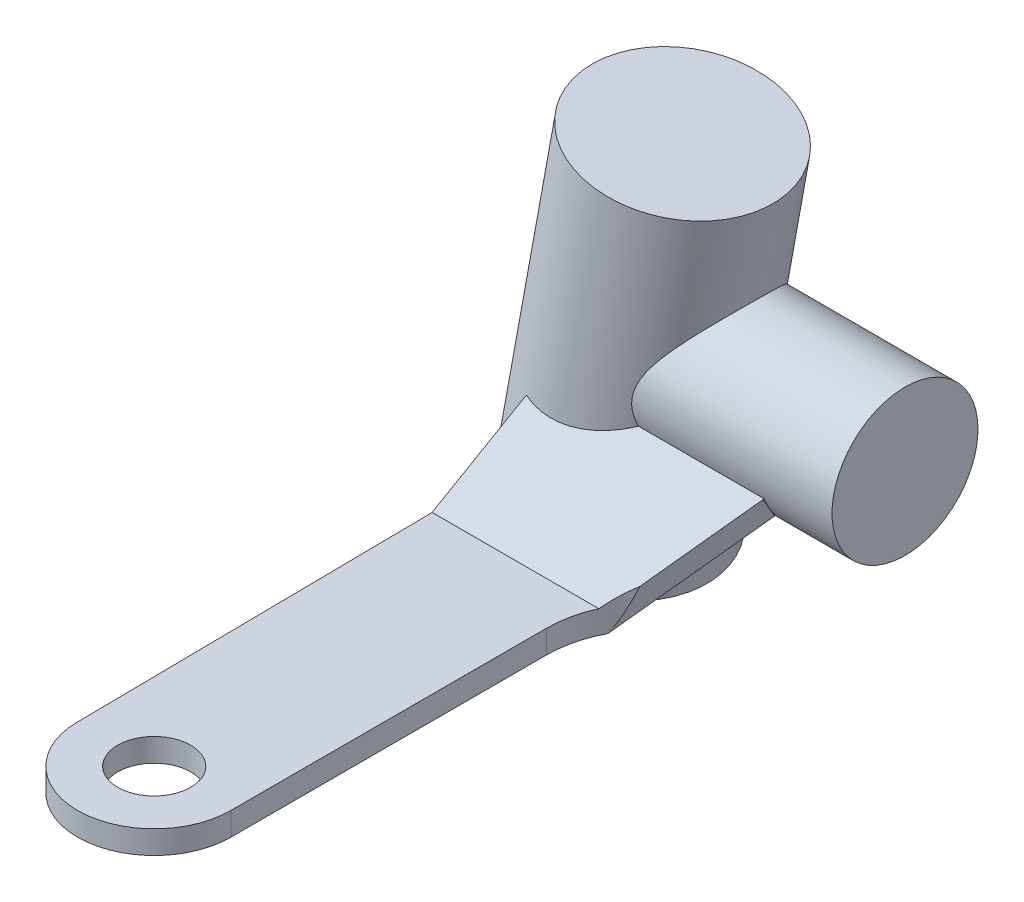
ISO-10303-21;
HEADER;
FILE_DESCRIPTION(('STEP AP214'),'2;1');
FILE_NAME('part.step','',(''),(''),'','','');
FILE_SCHEMA(('AUTOMOTIVE_DESIGN { 1 0 10303 214 1 1 1 1 }'));
ENDSEC;
DATA;
#1=APPLICATION_CONTEXT('core data for automotive mechanical design processes');
#2=APPLICATION_PROTOCOL_DEFINITION('international standard','automotive_design',2000,#1);
#3=PRODUCT_CONTEXT('',#1,'mechanical');
#4=PRODUCT('Part','Part','',(#3));
#5=PRODUCT_RELATED_PRODUCT_CATEGORY('part','',(#4));
#6=PRODUCT_DEFINITION_FORMATION('','',#4);
#7=PRODUCT_DEFINITION_CONTEXT('part definition',#1,'design');
#8=PRODUCT_DEFINITION('design','',#6,#7);
#9=PRODUCT_DEFINITION_SHAPE('','',#8);
#10=(LENGTH_UNIT() NAMED_UNIT(*) SI_UNIT(.MILLI.,.METRE.));
#11=(NAMED_UNIT(*) PLANE_ANGLE_UNIT() SI_UNIT($,.RADIAN.));
#12=(NAMED_UNIT(*) SI_UNIT($,.STERADIAN.) SOLID_ANGLE_UNIT());
#13=UNCERTAINTY_MEASURE_WITH_UNIT(LENGTH_MEASURE(1.E-05),#10,'distance_accuracy_value','');
#14=(GEOMETRIC_REPRESENTATION_CONTEXT(3) GLOBAL_UNCERTAINTY_ASSIGNED_CONTEXT((#13)) GLOBAL_UNIT_ASSIGNED_CONTEXT((#10,
#11,#12)) REPRESENTATION_CONTEXT('',''));
#15=CARTESIAN_POINT('',(0.,0.,0.));
#16=DIRECTION('',(0.,0.,1.));
#17=DIRECTION('',(1.,0.,0.));
#18=AXIS2_PLACEMENT_3D('',#15,#16,#17);
#19=CARTESIAN_POINT('',(-15.,1.37481532850781,0.793749999999992));
#20=DIRECTION('',(0.,0.866025403784441,0.499999999999995));
#21=DIRECTION('',(0.,-0.499999999999995,0.866025403784441));
#22=AXIS2_PLACEMENT_3D('',#19,#20,#21);
#23=PLANE('',#22);
#24=CARTESIAN_POINT('',(21.0561890606606,-15.8813614875702,30.6823249898396));
#25=DIRECTION('',(0.,0.866025403784441,0.499999999999995));
#26=DIRECTION('',(0.,-0.499999999999995,0.866025403784441));
#27=AXIS2_PLACEMENT_3D('',#24,#25,#26);
#28=ELLIPSE('',#27,16.7167610273511,14.4771397186797);
#29=CARTESIAN_POINT('',(10.0122158866274,-10.4770967837951,21.3218639453498));
#30=VERTEX_POINT('',#29);
#31=CARTESIAN_POINT('',(7.8311056060336,-12.4811290419705,24.7929496365167));
#32=VERTEX_POINT('',#31);
#33=EDGE_CURVE('E121',#30,#32,#28,.T.);
#34=ORIENTED_EDGE('',*,*,#33,.F.);
#35=DIRECTION('',(-0.342020143325663,-0.469846310392951,0.813797681349378));
#36=VECTOR('',#35,1.);
#37=CARTESIAN_POINT('',(14.7046046952174,-4.03098063634365,10.1568632664737));
#38=LINE('',#37,#36);
#39=CARTESIAN_POINT('',(15.,-3.62518467149215,9.45400403784441));
#40=VERTEX_POINT('',#39);
#41=EDGE_CURVE('E169',#40,#30,#38,.T.);
#42=ORIENTED_EDGE('',*,*,#41,.F.);
#43=DIRECTION('',(0.,-0.499999999999995,0.866025403784441));
#44=VECTOR('',#43,1.);
#45=CARTESIAN_POINT('',(15.,1.37481532850781,0.793749999999992));
#46=LINE('',#45,#44);
#47=CARTESIAN_POINT('',(15.,-3.56177873395059,9.3441817325209));
#48=VERTEX_POINT('',#47);
#49=EDGE_CURVE('E173',#48,#40,#46,.T.);
#50=ORIENTED_EDGE('',*,*,#49,.F.);
#51=DIRECTION('',(1.,0.,0.));
#52=VECTOR('',#51,1.);
#53=CARTESIAN_POINT('',(-10.,-3.56177873395059,9.3441817325209));
#54=LINE('',#53,#52);
#55=CARTESIAN_POINT('',(-2.17948771262395,-3.56177873395059,9.3441817325209));
#56=VERTEX_POINT('',#55);
#57=EDGE_CURVE('E407',#48,#56,#54,.F.);
#58=ORIENTED_EDGE('',*,*,#57,.T.);
#59=CARTESIAN_POINT('',(-9.67541691041208,1.8407542722661,-0.0132799238143488));
#60=DIRECTION('',(0.,0.866025403784441,0.499999999999995));
#61=DIRECTION('',(-0.328928894416636,-0.472177345501093,0.817835152590907));
#62=AXIS2_PLACEMENT_3D('',#59,#60,#61);
#63=ELLIPSE('',#62,14.7181064224041,12.5);
#64=CARTESIAN_POINT('',(-15.,-5.0179719781113,11.8663824170458));
#65=VERTEX_POINT('',#64);
#66=EDGE_CURVE('E187',#65,#56,#63,.T.);
#67=ORIENTED_EDGE('',*,*,#66,.F.);
#68=DIRECTION('',(0.,-0.499999999999995,0.866025403784441));
#69=VECTOR('',#68,1.);
#70=CARTESIAN_POINT('',(-15.,1.37481532850781,0.793749999999992));
#71=LINE('',#70,#69);
#72=CARTESIAN_POINT('',(-15.,-12.9064983849549,25.5297109505479));
#73=VERTEX_POINT('',#72);
#74=EDGE_CURVE('E179',#65,#73,#71,.T.);
#75=ORIENTED_EDGE('',*,*,#74,.T.);
#76=DIRECTION('',(1.,0.,0.));
#77=VECTOR('',#76,1.);
#78=CARTESIAN_POINT('',(-15.,-12.9064983849549,25.5297109505479));
#79=LINE('',#78,#77);
#80=CARTESIAN_POINT('',(-14.9816151833921,-12.9064983849549,25.5297109505479));
#81=VERTEX_POINT('',#80);
#82=EDGE_CURVE('E183',#73,#81,#79,.T.);
#83=ORIENTED_EDGE('',*,*,#82,.T.);
#84=DIRECTION('',(-0.0100289244147285,0.499974854536472,-0.865981850564039));
#85=VECTOR('',#84,1.);
#86=CARTESIAN_POINT('',(-15.2680550581169,1.37347110894734,0.79607825657525));
#87=LINE('',#86,#85);
#88=CARTESIAN_POINT('',(-14.9901476064738,-12.4811290419705,24.7929496365167));
#89=VERTEX_POINT('',#88);
#90=EDGE_CURVE('E51',#81,#89,#87,.T.);
#91=ORIENTED_EDGE('',*,*,#90,.T.);
#92=DIRECTION('',(1.,0.,0.));
#93=VECTOR('',#92,1.);
#94=CARTESIAN_POINT('',(-15.,-12.4811290419705,24.7929496365167));
#95=LINE('',#94,#93);
#96=EDGE_CURVE('E132',#89,#32,#95,.T.);
#97=ORIENTED_EDGE('',*,*,#96,.T.);
#98=EDGE_LOOP('',(#34,#42,#50,#58,#67,#75,#83,#91,#97));
#99=FACE_BOUND('',#98,.T.);
#100=ADVANCED_FACE('F34',(#99),#23,.T.);
#101=CARTESIAN_POINT('',(-15.,-12.9064983849549,25.5297109505479));
#102=DIRECTION('',(0.,-0.499999999999995,0.866025403784441));
#103=DIRECTION('',(0.,-0.866025403784441,-0.499999999999995));
#104=AXIS2_PLACEMENT_3D('',#101,#102,#103);
#105=PLANE('',#104);
#106=DIRECTION('',(0.,-0.866025403784441,-0.499999999999995));
#107=VECTOR('',#106,1.);
#108=CARTESIAN_POINT('',(-15.,-12.9064983849549,25.5297109505479));
#109=LINE('',#108,#107);
#110=CARTESIAN_POINT('',(-15.,-15.6561290419705,23.9422109505479));
#111=VERTEX_POINT('',#110);
#112=EDGE_CURVE('E181',#73,#111,#109,.T.);
#113=ORIENTED_EDGE('',*,*,#112,.T.);
#114=DIRECTION('',(0.0057903963451655,0.866010885314168,0.499991617757275));
#115=VECTOR('',#114,1.);
#116=CARTESIAN_POINT('',(-14.9816157998109,-12.9065905764684,25.5296577237528));
#117=LINE('',#116,#115);
#118=EDGE_CURVE('E59',#111,#81,#117,.T.);
#119=ORIENTED_EDGE('',*,*,#118,.T.);
#120=ORIENTED_EDGE('',*,*,#82,.F.);
#121=EDGE_LOOP('',(#113,#119,#120));
#122=FACE_BOUND('',#121,.T.);
#123=ADVANCED_FACE('F232',(#122),#105,.T.);
#124=CARTESIAN_POINT('',(15.,0.,0.));
#125=DIRECTION('',(1.,0.,0.));
#126=DIRECTION('',(0.,0.,-1.));
#127=AXIS2_PLACEMENT_3D('',#124,#125,#126);
#128=PLANE('',#127);
#129=DIRECTION('',(0.,0.866025403784441,0.499999999999995));
#130=VECTOR('',#129,1.);
#131=CARTESIAN_POINT('',(15.,-4.99999999999996,8.66025403784442));
#132=LINE('',#131,#130);
#133=CARTESIAN_POINT('',(15.,-6.37481532850775,7.86650403784443));
#134=VERTEX_POINT('',#133);
#135=CARTESIAN_POINT('',(15.,-4.99999999999996,8.66025403784442));
#136=VERTEX_POINT('',#135);
#137=EDGE_CURVE('E11',#134,#136,#132,.T.);
#138=ORIENTED_EDGE('',*,*,#137,.F.);
#139=DIRECTION('',(0.,0.499999999999995,-0.866025403784441));
#140=VECTOR('',#139,1.);
#141=CARTESIAN_POINT('',(15.,-15.6561290419705,23.9422109505479));
#142=LINE('',#141,#140);
#143=CARTESIAN_POINT('',(15.,-6.3114093909662,7.75668173252092));
#144=VERTEX_POINT('',#143);
#145=EDGE_CURVE('E171',#134,#144,#142,.T.);
#146=ORIENTED_EDGE('',*,*,#145,.T.);
#147=CARTESIAN_POINT('',(15.,0.,0.));
#148=DIRECTION('',(1.,0.,0.));
#149=DIRECTION('',(0.,0.,-1.));
#150=AXIS2_PLACEMENT_3D('',#147,#148,#149);
#151=CIRCLE('',#150,10.);
#152=EDGE_CURVE('E208',#144,#136,#151,.F.);
#153=ORIENTED_EDGE('',*,*,#152,.T.);
#154=EDGE_LOOP('',(#138,#146,#153));
#155=FACE_BOUND('',#154,.T.);
#156=ADVANCED_FACE('F215',(#155),#128,.T.);
#157=CARTESIAN_POINT('',(-5.65879555832661,24.6195531410487,-0.177615119509685));
#158=DIRECTION('',(-0.173648177666927,-0.984782125641946,0.00710460478038752));
#159=DIRECTION('',(0.984806980223185,-0.173652560314242,0.));
#160=AXIS2_PLACEMENT_3D('',#157,#158,#159);
#161=CYLINDRICAL_SURFACE('',#160,12.5);
#162=CARTESIAN_POINT('',(-2.37122751207205,0.,-10.));
#163=CARTESIAN_POINT('',(-2.33186606656457,0.211547890563131,-10.0000021967534));
#164=CARTESIAN_POINT('',(-2.28368754730734,0.421419531292979,-9.99327450323766));
#165=CARTESIAN_POINT('',(-2.17144491383989,0.836140913414193,-9.96714988500936));
#166=CARTESIAN_POINT('',(-2.10737167001065,1.04098769405718,-9.94774566865033));
#167=CARTESIAN_POINT('',(-1.96542419577827,1.44510738333065,-9.89713608826799));
#168=CARTESIAN_POINT('',(-1.88750180419782,1.64435793621536,-9.86588909642186));
#169=CARTESIAN_POINT('',(-1.72048337442154,2.0359977928105,-9.79256917752428));
#170=CARTESIAN_POINT('',(-1.63138715454737,2.22838698489487,-9.75049607443645));
#171=CARTESIAN_POINT('',(-1.39976379415893,2.69627847041153,-9.6339385297028));
#172=CARTESIAN_POINT('',(-1.25199974111008,2.96772270158199,-9.55356127350568));
#173=CARTESIAN_POINT('',(-0.943425698627354,3.49626022907402,-9.37305820149386));
#174=CARTESIAN_POINT('',(-0.78260811966236,3.75334502782919,-9.27292084771806));
#175=CARTESIAN_POINT('',(-0.452640844529678,4.25441363553669,-9.05399382146521));
#176=CARTESIAN_POINT('',(-0.283479203376289,4.49837755240461,-8.93517684301814));
#177=CARTESIAN_POINT('',(0.0590307194257454,4.97353944026718,-8.67966884171438));
#178=CARTESIAN_POINT('',(0.232378177374104,5.20473989394571,-8.54298131249322));
#179=CARTESIAN_POINT('',(0.591245544738462,5.66930349533057,-8.2425920753871));
#180=CARTESIAN_POINT('',(0.776834554894736,5.901858318689,-8.07772142252491));
#181=CARTESIAN_POINT('',(1.14586841508491,6.35315605003508,-7.72780365024937));
#182=CARTESIAN_POINT('',(1.32931294962832,6.57189694607847,-7.54275360243948));
#183=CARTESIAN_POINT('',(1.69064510153078,6.99469553150067,-7.15240100372609));
#184=CARTESIAN_POINT('',(1.86854085530249,7.19877535303141,-6.9471301381845));
#185=CARTESIAN_POINT('',(2.21581781142048,7.59138398738598,-6.51582595045574));
#186=CARTESIAN_POINT('',(2.38520146714816,7.77991729122928,-6.28979866446591));
#187=CARTESIAN_POINT('',(2.80105825472849,8.23764326346652,-5.68782880187569));
#188=CARTESIAN_POINT('',(3.03956963634143,8.49518593570571,-5.2970178078644));
#189=CARTESIAN_POINT('',(3.36567692484083,8.84376127887212,-4.67381613537803));
#190=CARTESIAN_POINT('',(3.46909072496176,8.95365081272702,-4.45994987554715));
#191=CARTESIAN_POINT('',(3.66357804300275,9.15953499925609,-4.02017393038783));
#192=CARTESIAN_POINT('',(3.75465383754625,9.2555322155809,-3.79426647766395));
#193=CARTESIAN_POINT('',(3.90777915691697,9.41659872489991,-3.37186192997674));
#194=CARTESIAN_POINT('',(3.97211925772817,9.48414065367897,-3.17713338429019));
#195=CARTESIAN_POINT('',(4.08994600812166,9.60779247837148,-2.78089391435279));
#196=CARTESIAN_POINT('',(4.14343500064624,9.66390484213673,-2.57938446519498));
#197=CARTESIAN_POINT('',(4.23852515965061,9.76382860701491,-2.17068638331255));
#198=CARTESIAN_POINT('',(4.28013231811281,9.80764620815401,-1.96350067109466));
#199=CARTESIAN_POINT('',(4.35062051658547,9.8822723127342,-1.54464821981776));
#200=CARTESIAN_POINT('',(4.37950146362579,9.91308072113776,-1.33298144803461));
#201=CARTESIAN_POINT('',(4.42398318113285,9.9612297501651,-0.905720013655074));
#202=CARTESIAN_POINT('',(4.43952162824781,9.97850713418682,-0.69011167093636));
#203=CARTESIAN_POINT('',(4.45671591731593,9.99902292678675,-0.257671354289186));
#204=CARTESIAN_POINT('',(4.45837174496848,10.0022613209033,-0.0408393791004808));
#205=CARTESIAN_POINT('',(4.44776032400616,9.99465139663323,0.392239109894308));
#206=CARTESIAN_POINT('',(4.43549259195285,9.98380258912456,0.608485603110611));
#207=CARTESIAN_POINT('',(4.39733012404207,9.94825870487492,1.03861262478124));
#208=CARTESIAN_POINT('',(4.37143571842103,9.9235639636831,1.25249321044405));
#209=CARTESIAN_POINT('',(4.30892217229414,9.86305579815202,1.66125114097922));
#210=CARTESIAN_POINT('',(4.2731922789526,9.82815350115491,1.8564017018136));
#211=CARTESIAN_POINT('',(4.19114692880275,9.74737483347136,2.24221884995754));
#212=CARTESIAN_POINT('',(4.14482752761635,9.70149437334294,2.43288373718437));
#213=CARTESIAN_POINT('',(4.04241120501084,9.59942862119815,2.80871635820001));
#214=CARTESIAN_POINT('',(3.98631505505307,9.54324414223055,2.99388452437456));
#215=CARTESIAN_POINT('',(3.86520840489644,9.42127210101571,3.35805405113932));
#216=CARTESIAN_POINT('',(3.8001960184005,9.35548250654328,3.53705409676386));
#217=CARTESIAN_POINT('',(3.63426494259953,9.18663682171188,3.95932083644448));
#218=CARTESIAN_POINT('',(3.52944939818889,9.07926128904359,4.19934414556875));
#219=CARTESIAN_POINT('',(3.30647746705372,8.84888437954846,4.66528178693352));
#220=CARTESIAN_POINT('',(3.18831658989402,8.72587774141745,4.89119133022619));
#221=CARTESIAN_POINT('',(2.94075898111936,8.46567714086706,5.32890852208008));
#222=CARTESIAN_POINT('',(2.81134012176331,8.32845513209255,5.54068688376459));
#223=CARTESIAN_POINT('',(2.54365888414883,8.04145943474058,5.94956537956503));
#224=CARTESIAN_POINT('',(2.40539644684966,7.89168566236403,6.14666541566776));
#225=CARTESIAN_POINT('',(2.07332870336902,7.52726567410016,6.59158659617227));
#226=CARTESIAN_POINT('',(1.87675657102934,7.30800623447057,6.83357791510917));
#227=CARTESIAN_POINT('',(1.47570717542312,6.85067916165105,7.29198854800531));
#228=CARTESIAN_POINT('',(1.27122645420295,6.61260325256417,7.50839650422796));
#229=CARTESIAN_POINT('',(0.858638678555726,6.11846596482342,7.9162550853694));
#230=CARTESIAN_POINT('',(0.650528913542538,5.86239066798211,8.10768606255246));
#231=CARTESIAN_POINT('',(0.235534034165025,5.33256457654742,8.46557484336424));
#232=CARTESIAN_POINT('',(0.028648474004249,5.05882071159103,8.63204235358637));
#233=CARTESIAN_POINT('',(-0.32025511447809,4.57376915031572,8.89569969113249));
#234=CARTESIAN_POINT('',(-0.463907479872336,4.36698770284174,8.99908880713032));
#235=CARTESIAN_POINT('',(-0.745409765948771,3.94343062551648,9.19258366168271));
#236=CARTESIAN_POINT('',(-0.883259431359649,3.72665455686082,9.2826888162871));
#237=CARTESIAN_POINT('',(-1.14987601134081,3.28298707864525,9.44869993638791));
#238=CARTESIAN_POINT('',(-1.27866273658981,3.05611962088625,9.52463751184776));
#239=CARTESIAN_POINT('',(-1.52376268169412,2.59149947176008,9.66140946313962));
#240=CARTESIAN_POINT('',(-1.64008134546216,2.35375159633317,9.72225044596026));
#241=CARTESIAN_POINT('',(-1.89737850075857,1.77342969450779,9.84750429976642));
#242=CARTESIAN_POINT('',(-2.03072922881497,1.42559401747437,9.90435395104461));
#243=CARTESIAN_POINT('',(-2.19674975318442,0.890811363704197,9.96185802892019));
#244=CARTESIAN_POINT('',(-2.24640283771843,0.710490369163447,9.97639724531068));
#245=CARTESIAN_POINT('',(-2.33310629203206,0.346270819223305,9.99566463607511));
#246=CARTESIAN_POINT('',(-2.3701570086593,0.162372362431615,10.0003930804835));
#247=CARTESIAN_POINT('',(-2.43086337844946,-0.208941744382549,9.99955274444552));
#248=CARTESIAN_POINT('',(-2.4544227581366,-0.396373050189421,9.99391113595739));
#249=CARTESIAN_POINT('',(-2.48738707190154,-0.771850531865798,9.97194105379317));
#250=CARTESIAN_POINT('',(-2.49679228488336,-0.95989669554652,9.95561279070381));
#251=CARTESIAN_POINT('',(-2.50182467301423,-1.33513931918095,9.91227108615452));
#252=CARTESIAN_POINT('',(-2.49743619573934,-1.52233457226841,9.88524553632704));
#253=CARTESIAN_POINT('',(-2.4758772153313,-1.89416968249486,9.82078142709529));
#254=CARTESIAN_POINT('',(-2.45870479930288,-2.0788091529932,9.78334130985637));
#255=CARTESIAN_POINT('',(-2.4085046122391,-2.48064387427573,9.69004495953675));
#256=CARTESIAN_POINT('',(-2.37300543217018,-2.69702284073688,9.63200805660558));
#257=CARTESIAN_POINT('',(-2.28864002985773,-3.1230027525743,9.50244521791399));
#258=CARTESIAN_POINT('',(-2.23977052476672,-3.33260201916306,9.43091597068766));
#259=CARTESIAN_POINT('',(-2.13142796809475,-3.74467110437023,9.27502440664462));
#260=CARTESIAN_POINT('',(-2.07193133743955,-3.94712384512418,9.19063361549666));
#261=CARTESIAN_POINT('',(-1.94503323750642,-4.34399135095342,9.00984464215801));
#262=CARTESIAN_POINT('',(-1.87763127804674,-4.53840561657903,8.91344571536186));
#263=CARTESIAN_POINT('',(-1.71109248770018,-4.98979451834596,8.671202684952));
#264=CARTESIAN_POINT('',(-1.60947467085126,-5.24315101659021,8.5203014560125));
#265=CARTESIAN_POINT('',(-1.40057101248385,-5.73402666989541,8.19799899782456));
#266=CARTESIAN_POINT('',(-1.2932833642121,-5.97154072137944,8.0265912116797));
#267=CARTESIAN_POINT('',(-1.0770050470731,-6.4302725218313,7.66401197234176));
#268=CARTESIAN_POINT('',(-0.968013869292171,-6.65148528362465,7.47283451350389));
#269=CARTESIAN_POINT('',(-0.751738636116376,-7.07675252148927,7.07142506784928));
#270=CARTESIAN_POINT('',(-0.644454393866361,-7.28080888626472,6.86119518377428));
#271=CARTESIAN_POINT('',(-0.433530399479624,-7.67257605127864,6.42023118532409));
#272=CARTESIAN_POINT('',(-0.3299348595788,-7.86011348292645,6.18932152381573));
#273=CARTESIAN_POINT('',(-0.130225328346403,-8.21523380076986,5.70955278040693));
#274=CARTESIAN_POINT('',(-0.0341116643805851,-8.38281581399582,5.46069291402102));
#275=CARTESIAN_POINT('',(0.147980275689365,-8.69617603452572,4.94642184217164));
#276=CARTESIAN_POINT('',(0.233968272499609,-8.84197519026253,4.6810268910981));
#277=CARTESIAN_POINT('',(0.393530215095557,-9.11008936478797,4.13505944147093));
#278=CARTESIAN_POINT('',(0.467105924427729,-9.23240772008624,3.85448910653987));
#279=CARTESIAN_POINT('',(0.594157395947255,-9.44251947498398,3.30426439300656));
#280=CARTESIAN_POINT('',(0.64879850645238,-9.53234285793846,3.03565469703358));
#281=CARTESIAN_POINT('',(0.744420821228715,-9.68932833045953,2.48950201817202));
#282=CARTESIAN_POINT('',(0.78540264279105,-9.75649144409159,2.21195943960039));
#283=CARTESIAN_POINT('',(0.852538712758157,-9.86696986070667,1.65065191573115));
#284=CARTESIAN_POINT('',(0.878706086608928,-9.91030627291294,1.36689271059772));
#285=CARTESIAN_POINT('',(0.915507342333786,-9.97242822950615,0.795714215395379));
#286=CARTESIAN_POINT('',(0.926143485151564,-9.99121734729941,0.508295464207432));
#287=CARTESIAN_POINT('',(0.931183823862741,-10.00298988772,-0.0251480186186683));
#288=CARTESIAN_POINT('',(0.927732150594609,-9.99934196025681,-0.271086460327969));
#289=CARTESIAN_POINT('',(0.909366142182668,-9.97398035531322,-0.761577900740032));
#290=CARTESIAN_POINT('',(0.894453197689782,-9.95226886954445,-1.0061310638991));
#291=CARTESIAN_POINT('',(0.853485256010194,-9.89109634551444,-1.49203965578106));
#292=CARTESIAN_POINT('',(0.827430742967443,-9.85163607850208,-1.73339522298199));
#293=CARTESIAN_POINT('',(0.764722807999863,-9.75550015628062,-2.21124781168161));
#294=CARTESIAN_POINT('',(0.728069068074645,-9.69882398455352,-2.44774468718068));
#295=CARTESIAN_POINT('',(0.645713602808179,-9.57023844202447,-2.90979722538828));
#296=CARTESIAN_POINT('',(0.600203096877929,-9.49864907834889,-3.13547645095274));
#297=CARTESIAN_POINT('',(0.500518223628218,-9.3403501378941,-3.57958933749246));
#298=CARTESIAN_POINT('',(0.446340379644377,-9.25363449235615,-3.79802004829284));
#299=CARTESIAN_POINT('',(0.330299872751209,-9.06596662206447,-4.22645594962455));
#300=CARTESIAN_POINT('',(0.268439772413213,-8.96501914311396,-4.43646391897177));
#301=CARTESIAN_POINT('',(0.138044741929391,-8.74969600787897,-4.8473320246006));
#302=CARTESIAN_POINT('',(0.069509062332841,-8.63531884358017,-5.04819113003829));
#303=CARTESIAN_POINT('',(-0.0809618171774494,-8.3807098382508,-5.46158547616653));
#304=CARTESIAN_POINT('',(-0.163542317309559,-8.23901822910663,-5.67298715853432));
#305=CARTESIAN_POINT('',(-0.333987884274284,-7.94109963547845,-6.0830234696671));
#306=CARTESIAN_POINT('',(-0.42185331457517,-7.78487165085787,-6.28165721837632));
#307=CARTESIAN_POINT('',(-0.601337511217455,-7.45845766924489,-6.6659646299785));
#308=CARTESIAN_POINT('',(-0.692962663569282,-7.28824738638695,-6.8516146602383));
#309=CARTESIAN_POINT('',(-0.877981733561464,-6.93480957028452,-7.20913392615413));
#310=CARTESIAN_POINT('',(-0.971375768589472,-6.75158117088836,-7.38100224323063));
#311=CARTESIAN_POINT('',(-1.17235695436097,-6.34325918758305,-7.736096487849));
#312=CARTESIAN_POINT('',(-1.27990068551568,-6.1160781180272,-7.91695495618767));
#313=CARTESIAN_POINT('',(-1.49102683957713,-5.64553346079412,-8.25909193683406));
#314=CARTESIAN_POINT('',(-1.59460787194507,-5.40216427316459,-8.42036361839661));
#315=CARTESIAN_POINT('',(-1.79316400885699,-4.90014437704894,-8.72205268467073));
#316=CARTESIAN_POINT('',(-1.88815480888308,-4.64152302632854,-8.86250841576338));
#317=CARTESIAN_POINT('',(-2.06425984246359,-4.10911563043895,-9.12154905994106));
#318=CARTESIAN_POINT('',(-2.14538495062301,-3.83534169433897,-9.24015111820905));
#319=CARTESIAN_POINT('',(-2.25931114872677,-3.38404551841053,-9.41177544103064));
#320=CARTESIAN_POINT('',(-2.29857611229383,-3.21096331645707,-9.47225658130746));
#321=CARTESIAN_POINT('',(-2.36791711143913,-2.86008163710103,-9.58403931234864));
#322=CARTESIAN_POINT('',(-2.39799636068404,-2.6822838331895,-9.63534411089199));
#323=CARTESIAN_POINT('',(-2.4472751464134,-2.3230939388944,-9.72818329524268));
#324=CARTESIAN_POINT('',(-2.46650002159509,-2.1417112511892,-9.76974030271203));
#325=CARTESIAN_POINT('',(-2.49270376826194,-1.77610143691013,-9.84277467468136));
#326=CARTESIAN_POINT('',(-2.49968659549417,-1.59187524856875,-9.87425529245515));
#327=CARTESIAN_POINT('',(-2.50037218200797,-1.17265420041852,-9.93381912517501));
#328=CARTESIAN_POINT('',(-2.49005077488307,-0.937183290492416,-9.95877404295726));
#329=CARTESIAN_POINT('',(-2.44711225286526,-0.467133089913396,-9.99186242559362));
#330=CARTESIAN_POINT('',(-2.41449738458498,-0.232553711811852,-9.99999758511818));
#331=CARTESIAN_POINT('',(-2.37122751207205,0.,-10.));
#332=B_SPLINE_CURVE_WITH_KNOTS('',3,(#162,#163,#164,#165,#166,#167,#168,#169,#170,#171,#172,
#173,#174,#175,#176,#177,#178,#179,#180,#181,#182,#183,#184,#185,#186,#187,#188,#189,#190,#191,
#192,#193,#194,#195,#196,#197,#198,#199,#200,#201,#202,#203,#204,#205,#206,#207,#208,#209,#210,
#211,#212,#213,#214,#215,#216,#217,#218,#219,#220,#221,#222,#223,#224,#225,#226,#227,#228,#229,
#230,#231,#232,#233,#234,#235,#236,#237,#238,#239,#240,#241,#242,#243,#244,#245,#246,#247,#248,
#249,#250,#251,#252,#253,#254,#255,#256,#257,#258,#259,#260,#261,#262,#263,#264,#265,#266,#267,
#268,#269,#270,#271,#272,#273,#274,#275,#276,#277,#278,#279,#280,#281,#282,#283,#284,#285,#286,
#287,#288,#289,#290,#291,#292,#293,#294,#295,#296,#297,#298,#299,#300,#301,#302,#303,#304,#305,
#306,#307,#308,#309,#310,#311,#312,#313,#314,#315,#316,#317,#318,#319,#320,#321,#322,#323,#324,
#325,#326,#327,#328,#329,#330,#331),.UNSPECIFIED.,.T.,.F.,(4,2,2,2,2,2,2,2,2,2,2,2,2,2,2,2,2,2,
2,2,2,2,2,2,2,2,2,2,2,2,2,2,2,2,2,2,2,2,2,2,2,2,2,2,2,2,2,2,2,2,2,2,2,2,2,2,2,2,2,2,2,2,2,2,2,2,
2,2,2,2,2,2,2,2,2,2,2,2,2,2,2,2,2,2,4),(0.,0.64522465940845,1.2908207848364,1.93870757482606,
2.5866049003498,3.54308986879376,4.50013499221728,5.45859236516448,6.41686264216371,
7.43645312313064,8.456191762585,9.47435718167892,10.4922274390164,12.0616440848503,
12.8461375120939,13.6304859859339,14.2776217267415,14.9246175906633,15.5712865974939,
16.2179603284266,16.8676385173054,17.5173173754236,18.1670187916626,18.8167044633995,
19.420386222954,20.0242932092041,20.6281525640644,21.2321398675572,22.0800736894566,
22.9282936787992,23.7782202500393,24.6281524960794,25.7699988232718,26.9123501845864,
28.0555948088472,29.1983937439824,30.0144512614338,30.830544641299,31.6447948325373,
32.458688038042,33.5844261972614,34.1466251232386,34.7088085748907,35.2749552892066,
35.8410908476088,36.4078690615616,36.9747321011196,37.6541646834922,38.3337642384973,
39.0148908306551,39.6960596794371,40.630513526065,41.5652669634786,42.5003051997858,
43.4352403649587,44.379042138471,45.3228851843754,46.2658146175826,47.2086099656794,
48.0726829918077,48.9367169634173,49.7999842070978,50.6631257689652,51.4001837822924,
52.1371523789574,52.8740889547597,53.6110476425933,54.3335761395937,55.0563951890921,
55.7789737721241,56.5016335709687,57.3035082977696,58.105438236278,58.9087917565481,
59.7121987775522,60.6401099762923,61.5683438535256,62.4948459303236,63.4206180007946,
63.9826952332271,64.5445755943379,65.1051388076305,65.6655208539089,66.3748851002116,
67.0841778712174),.UNSPECIFIED.);
#333=CARTESIAN_POINT('',(-1.13268287671445,-6.3114093909662,7.75668173252092));
#334=VERTEX_POINT('',#333);
#335=EDGE_CURVE('E196',#334,#56,#332,.T.);
#336=ORIENTED_EDGE('',*,*,#335,.F.);
#337=CARTESIAN_POINT('',(-10.3245830895875,-1.84075427226608,0.0132799238143547));
#338=DIRECTION('',(0.,-0.866025403784441,-0.499999999999995));
#339=DIRECTION('',(-0.328928894416636,-0.472177345501093,0.817835152590906));
#340=AXIS2_PLACEMENT_3D('',#337,#338,#339);
#341=ELLIPSE('',#340,14.7181064224041,12.5);
#342=CARTESIAN_POINT('',(-15.,-8.81842028986569,12.0989519845438));
#343=VERTEX_POINT('',#342);
#344=EDGE_CURVE('E190',#334,#343,#341,.T.);
#345=ORIENTED_EDGE('',*,*,#344,.T.);
#346=CARTESIAN_POINT('',(-15.,-28.3556711873731,0.204568941518499));
#347=DIRECTION('',(1.,0.,0.));
#348=DIRECTION('',(0.,-0.999973977286243,0.00721420476093617));
#349=AXIS2_PLACEMENT_3D('',#346,#347,#348);
#350=ELLIPSE('',#349,71.9846310392967,12.5);
#351=EDGE_CURVE('E415',#65,#343,#350,.T.);
#352=ORIENTED_EDGE('',*,*,#351,.F.);
#353=ORIENTED_EDGE('',*,*,#66,.T.);
#354=EDGE_LOOP('',(#336,#345,#352,#353));
#355=FACE_BOUND('',#354,.T.);
#356=CARTESIAN_POINT('',(-5.65879555832661,24.6195531410487,-0.177615119509685));
#357=DIRECTION('',(0.173648177666927,0.984782125641946,-0.00710460478038752));
#358=DIRECTION('',(-0.984806980223185,0.173652560314242,0.));
#359=AXIS2_PLACEMENT_3D('',#356,#357,#358);
#360=CIRCLE('',#359,12.5);
#361=CARTESIAN_POINT('',(-17.9688828111164,26.7902101449767,-0.177615119509685));
#362=VERTEX_POINT('',#361);
#363=EDGE_CURVE('E193',#362,#362,#360,.T.);
#364=ORIENTED_EDGE('',*,*,#363,.F.);
#365=EDGE_LOOP('',(#364));
#366=FACE_BOUND('',#365,.T.);
#367=CARTESIAN_POINT('',(-14.341204441673,-24.6195531410486,0.177615119509691));
#368=DIRECTION('',(0.173648177666927,0.984782125641946,-0.00710460478038752));
#369=DIRECTION('',(-0.984806980223185,0.173652560314242,0.));
#370=AXIS2_PLACEMENT_3D('',#367,#368,#369);
#371=CIRCLE('',#370,12.5);
#372=CARTESIAN_POINT('',(-26.6512916944628,-22.4488961371206,0.177615119509691));
#373=VERTEX_POINT('',#372);
#374=EDGE_CURVE('E192',#373,#373,#371,.T.);
#375=ORIENTED_EDGE('',*,*,#374,.T.);
#376=EDGE_LOOP('',(#375));
#377=FACE_BOUND('',#376,.T.);
#378=ADVANCED_FACE('F210',(#355,#366,#377),#161,.T.);
#379=CARTESIAN_POINT('',(-5.65879555832661,24.6195531410487,-0.177615119509685));
#380=DIRECTION('',(0.173648177666927,0.984782125641946,-0.00710460478038752));
#381=DIRECTION('',(-0.984806980223185,0.173652560314242,0.));
#382=AXIS2_PLACEMENT_3D('',#379,#380,#381);
#383=PLANE('',#382);
#384=ORIENTED_EDGE('',*,*,#363,.T.);
#385=EDGE_LOOP('',(#384));
#386=FACE_BOUND('',#385,.T.);
#387=ADVANCED_FACE('F214',(#386),#383,.T.);
#388=CARTESIAN_POINT('',(-14.341204441673,-24.6195531410486,0.177615119509691));
#389=DIRECTION('',(0.173648177666927,0.984782125641946,-0.00710460478038752));
#390=DIRECTION('',(-0.984806980223185,0.173652560314242,0.));
#391=AXIS2_PLACEMENT_3D('',#388,#389,#390);
#392=PLANE('',#391);
#393=ORIENTED_EDGE('',*,*,#374,.F.);
#394=EDGE_LOOP('',(#393));
#395=FACE_BOUND('',#394,.T.);
#396=ADVANCED_FACE('F217',(#395),#392,.F.);
#397=CARTESIAN_POINT('',(-10.,0.,0.));
#398=DIRECTION('',(1.,0.,0.));
#399=DIRECTION('',(0.,0.,-1.));
#400=AXIS2_PLACEMENT_3D('',#397,#398,#399);
#401=CYLINDRICAL_SURFACE('',#400,10.);
#402=DIRECTION('',(1.,0.,0.));
#403=VECTOR('',#402,1.);
#404=CARTESIAN_POINT('',(-10.,-6.3114093909662,7.75668173252092));
#405=LINE('',#404,#403);
#406=EDGE_CURVE('E399',#334,#144,#405,.T.);
#407=ORIENTED_EDGE('',*,*,#406,.F.);
#408=ORIENTED_EDGE('',*,*,#335,.T.);
#409=ORIENTED_EDGE('',*,*,#57,.F.);
#410=EDGE_CURVE('E202',#136,#48,#151,.F.);
#411=ORIENTED_EDGE('',*,*,#410,.F.);
#412=ORIENTED_EDGE('',*,*,#152,.F.);
#413=EDGE_LOOP('',(#407,#408,#409,#411,#412));
#414=FACE_BOUND('',#413,.T.);
#415=CARTESIAN_POINT('',(25.,0.,0.));
#416=DIRECTION('',(1.,0.,0.));
#417=DIRECTION('',(0.,0.,-1.));
#418=AXIS2_PLACEMENT_3D('',#415,#416,#417);
#419=CIRCLE('',#418,10.);
#420=CARTESIAN_POINT('',(25.,0.,-10.));
#421=VERTEX_POINT('',#420);
#422=EDGE_CURVE('E199',#421,#421,#419,.T.);
#423=ORIENTED_EDGE('',*,*,#422,.F.);
#424=EDGE_LOOP('',(#423));
#425=FACE_BOUND('',#424,.T.);
#426=ADVANCED_FACE('F36',(#414,#425),#401,.T.);
#427=CARTESIAN_POINT('',(25.,0.,0.));
#428=DIRECTION('',(1.,0.,0.));
#429=DIRECTION('',(0.,0.,-1.));
#430=AXIS2_PLACEMENT_3D('',#427,#428,#429);
#431=PLANE('',#430);
#432=ORIENTED_EDGE('',*,*,#422,.T.);
#433=EDGE_LOOP('',(#432));
#434=FACE_BOUND('',#433,.T.);
#435=ADVANCED_FACE('F219',(#434),#431,.T.);
#436=CARTESIAN_POINT('',(-15.,-15.6561290419705,23.9422109505479));
#437=DIRECTION('',(0.,-0.866025403784441,-0.499999999999995));
#438=DIRECTION('',(0.,0.499999999999995,-0.866025403784441));
#439=AXIS2_PLACEMENT_3D('',#436,#437,#438);
#440=PLANE('',#439);
#441=DIRECTION('',(0.342020143325663,0.469846310392951,-0.813797681349378));
#442=VECTOR('',#441,1.);
#443=CARTESIAN_POINT('',(15.,-6.37481532850775,7.86650403784443));
#444=LINE('',#443,#442);
#445=CARTESIAN_POINT('',(8.24375614682575,-15.6561290419705,23.9422109505479));
#446=VERTEX_POINT('',#445);
#447=EDGE_CURVE('E167',#446,#134,#444,.T.);
#448=ORIENTED_EDGE('',*,*,#447,.F.);
#449=DIRECTION('',(1.,0.,0.));
#450=VECTOR('',#449,1.);
#451=CARTESIAN_POINT('',(-15.,-15.6561290419705,23.9422109505479));
#452=LINE('',#451,#450);
#453=EDGE_CURVE('E184',#111,#446,#452,.T.);
#454=ORIENTED_EDGE('',*,*,#453,.F.);
#455=DIRECTION('',(0.,0.499999999999995,-0.866025403784441));
#456=VECTOR('',#455,1.);
#457=CARTESIAN_POINT('',(-15.,-15.6561290419705,23.9422109505479));
#458=LINE('',#457,#456);
#459=EDGE_CURVE('E176',#111,#343,#458,.T.);
#460=ORIENTED_EDGE('',*,*,#459,.T.);
#461=ORIENTED_EDGE('',*,*,#344,.F.);
#462=ORIENTED_EDGE('',*,*,#406,.T.);
#463=ORIENTED_EDGE('',*,*,#145,.F.);
#464=EDGE_LOOP('',(#448,#454,#460,#461,#462,#463));
#465=FACE_BOUND('',#464,.T.);
#466=ADVANCED_FACE('F221',(#465),#440,.T.);
#467=CARTESIAN_POINT('',(-15.,0.,0.));
#468=DIRECTION('',(1.,0.,0.));
#469=DIRECTION('',(0.,0.,-1.));
#470=AXIS2_PLACEMENT_3D('',#467,#468,#469);
#471=PLANE('',#470);
#472=ORIENTED_EDGE('',*,*,#74,.F.);
#473=ORIENTED_EDGE('',*,*,#351,.T.);
#474=ORIENTED_EDGE('',*,*,#459,.F.);
#475=ORIENTED_EDGE('',*,*,#112,.F.);
#476=EDGE_LOOP('',(#472,#473,#474,#475));
#477=FACE_BOUND('',#476,.T.);
#478=ADVANCED_FACE('F227',(#477),#471,.F.);
#479=EDGE_CURVE('E44',#136,#40,#132,.T.);
#480=ORIENTED_EDGE('',*,*,#479,.F.);
#481=ORIENTED_EDGE('',*,*,#410,.T.);
#482=ORIENTED_EDGE('',*,*,#49,.T.);
#483=EDGE_LOOP('',(#480,#481,#482));
#484=FACE_BOUND('',#483,.T.);
#485=ADVANCED_FACE('F267',(#484),#128,.T.);
#486=CARTESIAN_POINT('',(15.,2.28543870933667,12.8665040378444));
#487=DIRECTION('',(-0.93969262078591,0.17101007166283,-0.29619813272602));
#488=DIRECTION('',(-0.300626578483218,0.,0.953741925422949));
#489=AXIS2_PLACEMENT_3D('',#486,#487,#488);
#490=PLANE('',#489);
#491=ORIENTED_EDGE('',*,*,#41,.T.);
#492=CARTESIAN_POINT('',(21.0561890606606,66.4218311609699,30.6823249898396));
#493=DIRECTION('',(-0.93969262078591,0.17101007166283,-0.29619813272602));
#494=DIRECTION('',(-0.163099475014424,-0.985269280648633,-0.0514101727301669));
#495=AXIS2_PLACEMENT_3D('',#492,#493,#494);
#496=ELLIPSE('',#495,84.6566496225057,14.4771397186797);
#497=EDGE_CURVE('E127',#30,#446,#496,.T.);
#498=ORIENTED_EDGE('',*,*,#497,.T.);
#499=ORIENTED_EDGE('',*,*,#447,.T.);
#500=ORIENTED_EDGE('',*,*,#137,.T.);
#501=ORIENTED_EDGE('',*,*,#479,.T.);
#502=EDGE_LOOP('',(#491,#498,#499,#500,#501));
#503=FACE_BOUND('',#502,.T.);
#504=ADVANCED_FACE('F272',(#503),#490,.F.);
#505=CARTESIAN_POINT('',(21.0561890606606,-12.4811290419705,30.6823249898396));
#506=DIRECTION('',(0.,-1.,0.));
#507=DIRECTION('',(0.,0.,-1.));
#508=AXIS2_PLACEMENT_3D('',#505,#506,#507);
#509=CYLINDRICAL_SURFACE('',#508,14.4771397186797);
#510=ORIENTED_EDGE('',*,*,#33,.T.);
#511=CARTESIAN_POINT('',(21.0561890606606,-12.4811290419705,30.6823249898396));
#512=DIRECTION('',(0.,-1.,0.));
#513=DIRECTION('',(0.,0.,-1.));
#514=AXIS2_PLACEMENT_3D('',#511,#512,#513);
#515=CIRCLE('',#514,14.4771397186797);
#516=CARTESIAN_POINT('',(6.57904934198083,-12.4811290419705,30.6823249898396));
#517=VERTEX_POINT('',#516);
#518=EDGE_CURVE('E125',#517,#32,#515,.T.);
#519=ORIENTED_EDGE('',*,*,#518,.F.);
#520=DIRECTION('',(0.,-1.,0.));
#521=VECTOR('',#520,1.);
#522=CARTESIAN_POINT('',(6.57904934198083,-12.4811290419705,30.6823249898396));
#523=LINE('',#522,#521);
#524=CARTESIAN_POINT('',(6.57904934198082,-15.6561290419705,30.6823249898396));
#525=VERTEX_POINT('',#524);
#526=EDGE_CURVE('E155',#517,#525,#523,.T.);
#527=ORIENTED_EDGE('',*,*,#526,.T.);
#528=CARTESIAN_POINT('',(21.0561890606606,-15.6561290419705,30.6823249898396));
#529=DIRECTION('',(0.,-1.,0.));
#530=DIRECTION('',(0.,0.,-1.));
#531=AXIS2_PLACEMENT_3D('',#528,#529,#530);
#532=CIRCLE('',#531,14.4771397186797);
#533=EDGE_CURVE('E130',#525,#446,#532,.T.);
#534=ORIENTED_EDGE('',*,*,#533,.T.);
#535=ORIENTED_EDGE('',*,*,#497,.F.);
#536=EDGE_LOOP('',(#510,#519,#527,#534,#535));
#537=FACE_BOUND('',#536,.T.);
#538=ADVANCED_FACE('F122',(#537),#509,.F.);
#539=CARTESIAN_POINT('',(-15.275225728017,-12.4811290419705,0.176902188128324));
#540=DIRECTION('',(0.999932947116647,0.,-0.0115802103010565));
#541=DIRECTION('',(-0.0115802103010565,0.,-0.999932947116647));
#542=AXIS2_PLACEMENT_3D('',#539,#540,#541);
#543=PLANE('',#542);
#544=ORIENTED_EDGE('',*,*,#90,.F.);
#545=ORIENTED_EDGE('',*,*,#118,.F.);
#546=DIRECTION('',(0.0115802103010565,0.,0.999932947116647));
#547=VECTOR('',#546,1.);
#548=CARTESIAN_POINT('',(-15.275225728017,-15.6561290419705,0.176902188128322));
#549=LINE('',#548,#547);
#550=CARTESIAN_POINT('',(-14.4209506580192,-15.6561290419705,73.9422109505479));
#551=VERTEX_POINT('',#550);
#552=EDGE_CURVE('E142',#111,#551,#549,.T.);
#553=ORIENTED_EDGE('',*,*,#552,.T.);
#554=DIRECTION('',(0.,-1.,0.));
#555=VECTOR('',#554,1.);
#556=CARTESIAN_POINT('',(-14.4209506580192,-12.4811290419705,73.9422109505479));
#557=LINE('',#556,#555);
#558=CARTESIAN_POINT('',(-14.4209506580192,-12.4811290419705,73.9422109505479));
#559=VERTEX_POINT('',#558);
#560=EDGE_CURVE('E135',#559,#551,#557,.T.);
#561=ORIENTED_EDGE('',*,*,#560,.F.);
#562=DIRECTION('',(0.0115802103010565,0.,0.999932947116647));
#563=VECTOR('',#562,1.);
#564=CARTESIAN_POINT('',(-15.275225728017,-12.4811290419705,0.176902188128324));
#565=LINE('',#564,#563);
#566=EDGE_CURVE('E153',#89,#559,#565,.T.);
#567=ORIENTED_EDGE('',*,*,#566,.F.);
#568=EDGE_LOOP('',(#544,#545,#553,#561,#567));
#569=FACE_BOUND('',#568,.T.);
#570=ADVANCED_FACE('F296',(#569),#543,.F.);
#571=CARTESIAN_POINT('',(-3.92095065801919,-12.4811290419705,73.9422109505479));
#572=DIRECTION('',(0.,-1.,0.));
#573=DIRECTION('',(0.,0.,-1.));
#574=AXIS2_PLACEMENT_3D('',#571,#572,#573);
#575=CYLINDRICAL_SURFACE('',#574,10.5);
#576=CARTESIAN_POINT('',(-3.92095065801919,-15.6561290419705,73.9422109505479));
#577=DIRECTION('',(0.,-1.,0.));
#578=DIRECTION('',(0.,0.,-1.));
#579=AXIS2_PLACEMENT_3D('',#576,#577,#578);
#580=CIRCLE('',#579,10.5);
#581=CARTESIAN_POINT('',(6.57904934198081,-15.6561290419705,73.9422109505479));
#582=VERTEX_POINT('',#581);
#583=EDGE_CURVE('E147',#582,#551,#580,.T.);
#584=ORIENTED_EDGE('',*,*,#583,.F.);
#585=DIRECTION('',(0.,-1.,0.));
#586=VECTOR('',#585,1.);
#587=CARTESIAN_POINT('',(6.57904934198081,-12.4811290419705,73.9422109505479));
#588=LINE('',#587,#586);
#589=CARTESIAN_POINT('',(6.57904934198081,-12.4811290419705,73.9422109505479));
#590=VERTEX_POINT('',#589);
#591=EDGE_CURVE('E162',#590,#582,#588,.T.);
#592=ORIENTED_EDGE('',*,*,#591,.F.);
#593=CARTESIAN_POINT('',(-3.92095065801919,-12.4811290419705,73.9422109505479));
#594=DIRECTION('',(0.,-1.,0.));
#595=DIRECTION('',(0.,0.,-1.));
#596=AXIS2_PLACEMENT_3D('',#593,#594,#595);
#597=CIRCLE('',#596,10.5);
#598=EDGE_CURVE('E144',#590,#559,#597,.T.);
#599=ORIENTED_EDGE('',*,*,#598,.T.);
#600=ORIENTED_EDGE('',*,*,#560,.T.);
#601=EDGE_LOOP('',(#584,#592,#599,#600));
#602=FACE_BOUND('',#601,.T.);
#603=ADVANCED_FACE('F301',(#602),#575,.T.);
#604=CARTESIAN_POINT('',(6.57904934198084,-12.4811290419705,0.));
#605=DIRECTION('',(-1.,0.,0.));
#606=DIRECTION('',(0.,0.,1.));
#607=AXIS2_PLACEMENT_3D('',#604,#605,#606);
#608=PLANE('',#607);
#609=DIRECTION('',(0.,0.,-1.));
#610=VECTOR('',#609,1.);
#611=CARTESIAN_POINT('',(6.57904934198084,-15.6561290419705,0.));
#612=LINE('',#611,#610);
#613=EDGE_CURVE('E157',#582,#525,#612,.T.);
#614=ORIENTED_EDGE('',*,*,#613,.T.);
#615=ORIENTED_EDGE('',*,*,#526,.F.);
#616=DIRECTION('',(0.,0.,-1.));
#617=VECTOR('',#616,1.);
#618=CARTESIAN_POINT('',(6.57904934198084,-12.4811290419705,0.));
#619=LINE('',#618,#617);
#620=EDGE_CURVE('E140',#590,#517,#619,.T.);
#621=ORIENTED_EDGE('',*,*,#620,.F.);
#622=ORIENTED_EDGE('',*,*,#591,.T.);
#623=EDGE_LOOP('',(#614,#615,#621,#622));
#624=FACE_BOUND('',#623,.T.);
#625=ADVANCED_FACE('F313',(#624),#608,.F.);
#626=CARTESIAN_POINT('',(0.,-12.4811290419705,0.));
#627=DIRECTION('',(0.,-1.,0.));
#628=DIRECTION('',(0.,0.,-1.));
#629=AXIS2_PLACEMENT_3D('',#626,#627,#628);
#630=PLANE('',#629);
#631=CARTESIAN_POINT('',(-3.92095065801919,-12.4811290419705,73.9422109505479));
#632=DIRECTION('',(0.,1.,0.));
#633=DIRECTION('',(0.,0.,1.));
#634=AXIS2_PLACEMENT_3D('',#631,#632,#633);
#635=CIRCLE('',#634,5.);
#636=CARTESIAN_POINT('',(-3.92095065801919,-12.4811290419705,78.9422109505479));
#637=VERTEX_POINT('',#636);
#638=EDGE_CURVE('E385',#637,#637,#635,.T.);
#639=ORIENTED_EDGE('',*,*,#638,.F.);
#640=EDGE_LOOP('',(#639));
#641=FACE_BOUND('',#640,.T.);
#642=ORIENTED_EDGE('',*,*,#96,.F.);
#643=ORIENTED_EDGE('',*,*,#566,.T.);
#644=ORIENTED_EDGE('',*,*,#598,.F.);
#645=ORIENTED_EDGE('',*,*,#620,.T.);
#646=ORIENTED_EDGE('',*,*,#518,.T.);
#647=EDGE_LOOP('',(#642,#643,#644,#645,#646));
#648=FACE_BOUND('',#647,.T.);
#649=ADVANCED_FACE('F137',(#641,#648),#630,.F.);
#650=CARTESIAN_POINT('',(0.,-15.6561290419705,0.));
#651=DIRECTION('',(0.,-1.,0.));
#652=DIRECTION('',(0.,0.,-1.));
#653=AXIS2_PLACEMENT_3D('',#650,#651,#652);
#654=PLANE('',#653);
#655=CARTESIAN_POINT('',(-3.92095065801919,-15.6561290419705,73.9422109505479));
#656=DIRECTION('',(0.,-1.,0.));
#657=DIRECTION('',(0.,0.,-1.));
#658=AXIS2_PLACEMENT_3D('',#655,#656,#657);
#659=CIRCLE('',#658,5.);
#660=CARTESIAN_POINT('',(-3.92095065801919,-15.6561290419705,68.9422109505479));
#661=VERTEX_POINT('',#660);
#662=EDGE_CURVE('E39',#661,#661,#659,.T.);
#663=ORIENTED_EDGE('',*,*,#662,.F.);
#664=EDGE_LOOP('',(#663));
#665=FACE_BOUND('',#664,.T.);
#666=ORIENTED_EDGE('',*,*,#533,.F.);
#667=ORIENTED_EDGE('',*,*,#613,.F.);
#668=ORIENTED_EDGE('',*,*,#583,.T.);
#669=ORIENTED_EDGE('',*,*,#552,.F.);
#670=ORIENTED_EDGE('',*,*,#453,.T.);
#671=EDGE_LOOP('',(#666,#667,#668,#669,#670));
#672=FACE_BOUND('',#671,.T.);
#673=ADVANCED_FACE('F357',(#665,#672),#654,.T.);
#674=CARTESIAN_POINT('',(-3.92095065801919,-22.4811290419705,73.9422109505479));
#675=DIRECTION('',(0.,1.,0.));
#676=DIRECTION('',(0.,0.,1.));
#677=AXIS2_PLACEMENT_3D('',#674,#675,#676);
#678=CYLINDRICAL_SURFACE('',#677,5.);
#679=ORIENTED_EDGE('',*,*,#662,.T.);
#680=EDGE_LOOP('',(#679));
#681=FACE_BOUND('',#680,.T.);
#682=ORIENTED_EDGE('',*,*,#638,.T.);
#683=EDGE_LOOP('',(#682));
#684=FACE_BOUND('',#683,.T.);
#685=ADVANCED_FACE('F367',(#681,#684),#678,.F.);
#686=CLOSED_SHELL('',(#100,#123,#156,#378,#387,#396,#426,#435,#466,#478,#485,#504,#538,#570,
#603,#625,#649,#673,#685));
#687=MANIFOLD_SOLID_BREP('B2',#686);
#688=ADVANCED_BREP_SHAPE_REPRESENTATION('',(#18,#687),#14);
#689=SHAPE_DEFINITION_REPRESENTATION(#9,#688);
ENDSEC;
END-ISO-10303-21;
